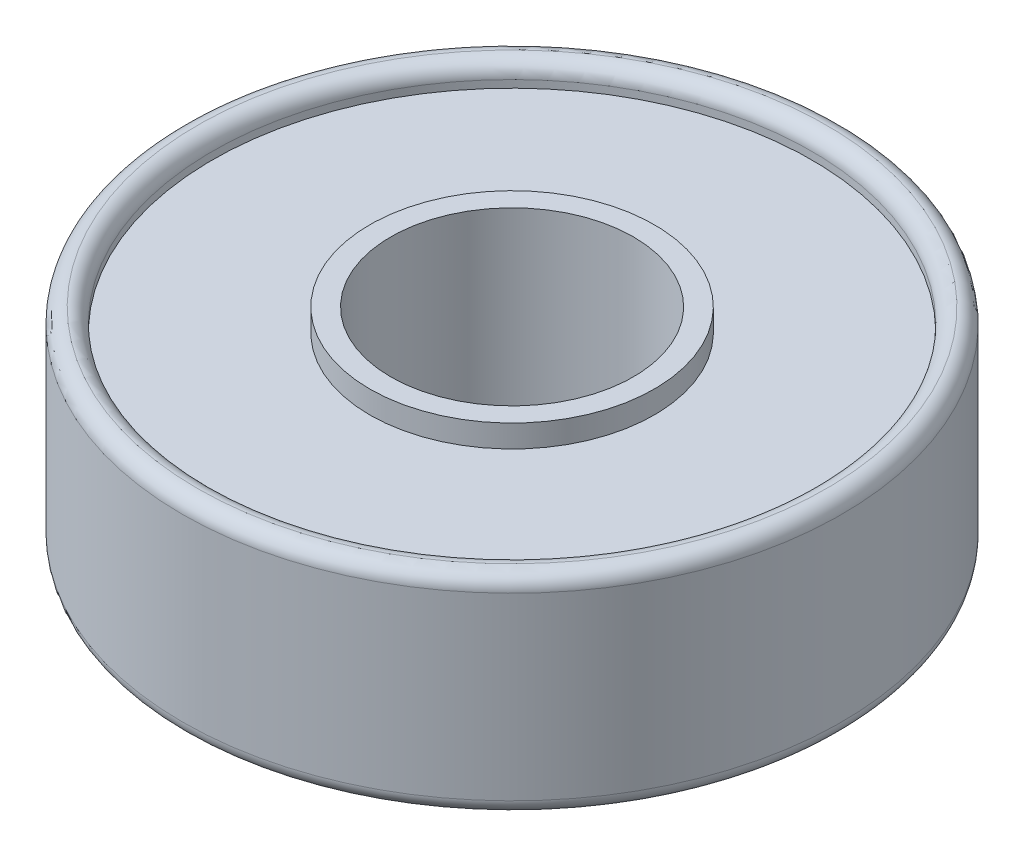
ISO-10303-21;
HEADER;
FILE_DESCRIPTION(('STEP AP214'),'2;1');
FILE_NAME('part.step','',(''),(''),'','','');
FILE_SCHEMA(('AUTOMOTIVE_DESIGN { 1 0 10303 214 1 1 1 1 }'));
ENDSEC;
DATA;
#1=APPLICATION_CONTEXT('core data for automotive mechanical design processes');
#2=APPLICATION_PROTOCOL_DEFINITION('international standard','automotive_design',2000,#1);
#3=PRODUCT_CONTEXT('',#1,'mechanical');
#4=PRODUCT('Part','Part','',(#3));
#5=PRODUCT_RELATED_PRODUCT_CATEGORY('part','',(#4));
#6=PRODUCT_DEFINITION_FORMATION('','',#4);
#7=PRODUCT_DEFINITION_CONTEXT('part definition',#1,'design');
#8=PRODUCT_DEFINITION('design','',#6,#7);
#9=PRODUCT_DEFINITION_SHAPE('','',#8);
#10=(LENGTH_UNIT() NAMED_UNIT(*) SI_UNIT(.MILLI.,.METRE.));
#11=(NAMED_UNIT(*) PLANE_ANGLE_UNIT() SI_UNIT($,.RADIAN.));
#12=(NAMED_UNIT(*) SI_UNIT($,.STERADIAN.) SOLID_ANGLE_UNIT());
#13=UNCERTAINTY_MEASURE_WITH_UNIT(LENGTH_MEASURE(1.E-05),#10,'distance_accuracy_value','');
#14=(GEOMETRIC_REPRESENTATION_CONTEXT(3) GLOBAL_UNCERTAINTY_ASSIGNED_CONTEXT((#13)) GLOBAL_UNIT_ASSIGNED_CONTEXT((#10,
#11,#12)) REPRESENTATION_CONTEXT('',''));
#15=CARTESIAN_POINT('',(0.,0.,0.));
#16=DIRECTION('',(0.,0.,1.));
#17=DIRECTION('',(1.,0.,0.));
#18=AXIS2_PLACEMENT_3D('',#15,#16,#17);
#19=CARTESIAN_POINT('',(0.,-3.5,0.));
#20=DIRECTION('',(0.,1.,0.));
#21=DIRECTION('',(0.,0.,1.));
#22=AXIS2_PLACEMENT_3D('',#19,#20,#21);
#23=CYLINDRICAL_SURFACE('',#22,10.);
#24=CARTESIAN_POINT('',(0.,-3.,0.));
#25=DIRECTION('',(0.,1.,0.));
#26=DIRECTION('',(0.,0.,1.));
#27=AXIS2_PLACEMENT_3D('',#24,#25,#26);
#28=CIRCLE('',#27,10.);
#29=CARTESIAN_POINT('',(0.,-3.,10.));
#30=VERTEX_POINT('',#29);
#31=EDGE_CURVE('E48',#30,#30,#28,.F.);
#32=ORIENTED_EDGE('',*,*,#31,.T.);
#33=EDGE_LOOP('',(#32));
#34=FACE_BOUND('',#33,.T.);
#35=CARTESIAN_POINT('',(0.,-2.75,0.));
#36=DIRECTION('',(0.,1.,0.));
#37=DIRECTION('',(0.,0.,1.));
#38=AXIS2_PLACEMENT_3D('',#35,#36,#37);
#39=CIRCLE('',#38,10.);
#40=CARTESIAN_POINT('',(0.,-2.75,10.));
#41=VERTEX_POINT('',#40);
#42=EDGE_CURVE('E108',#41,#41,#39,.F.);
#43=ORIENTED_EDGE('',*,*,#42,.F.);
#44=EDGE_LOOP('',(#43));
#45=FACE_BOUND('',#44,.T.);
#46=ADVANCED_FACE('F39',(#34,#45),#23,.F.);
#47=CARTESIAN_POINT('',(0.,3.5,0.));
#48=DIRECTION('',(0.,-1.,0.));
#49=DIRECTION('',(0.,0.,-1.));
#50=AXIS2_PLACEMENT_3D('',#47,#48,#49);
#51=CYLINDRICAL_SURFACE('',#50,11.);
#52=CARTESIAN_POINT('',(0.,-3.,0.));
#53=DIRECTION('',(0.,1.,0.));
#54=DIRECTION('',(0.,0.,1.));
#55=AXIS2_PLACEMENT_3D('',#52,#53,#54);
#56=CIRCLE('',#55,11.);
#57=CARTESIAN_POINT('',(0.,-3.,11.));
#58=VERTEX_POINT('',#57);
#59=EDGE_CURVE('E54',#58,#58,#56,.T.);
#60=ORIENTED_EDGE('',*,*,#59,.T.);
#61=EDGE_LOOP('',(#60));
#62=FACE_BOUND('',#61,.T.);
#63=CARTESIAN_POINT('',(0.,3.,0.));
#64=DIRECTION('',(0.,1.,0.));
#65=DIRECTION('',(0.,0.,1.));
#66=AXIS2_PLACEMENT_3D('',#63,#64,#65);
#67=CIRCLE('',#66,11.);
#68=CARTESIAN_POINT('',(0.,3.,11.));
#69=VERTEX_POINT('',#68);
#70=EDGE_CURVE('E114',#69,#69,#67,.F.);
#71=ORIENTED_EDGE('',*,*,#70,.T.);
#72=EDGE_LOOP('',(#71));
#73=FACE_BOUND('',#72,.T.);
#74=ADVANCED_FACE('F84',(#62,#73),#51,.T.);
#75=CARTESIAN_POINT('',(0.,3.,0.));
#76=DIRECTION('',(0.,1.,0.));
#77=DIRECTION('',(0.,0.,1.));
#78=AXIS2_PLACEMENT_3D('',#75,#76,#77);
#79=CIRCLE('',#78,10.);
#80=CARTESIAN_POINT('',(0.,3.,10.));
#81=VERTEX_POINT('',#80);
#82=EDGE_CURVE('E10',#81,#81,#79,.T.);
#83=ORIENTED_EDGE('',*,*,#82,.T.);
#84=EDGE_LOOP('',(#83));
#85=FACE_BOUND('',#84,.T.);
#86=CARTESIAN_POINT('',(0.,2.75,0.));
#87=DIRECTION('',(0.,1.,0.));
#88=DIRECTION('',(0.,0.,1.));
#89=AXIS2_PLACEMENT_3D('',#86,#87,#88);
#90=CIRCLE('',#89,10.);
#91=CARTESIAN_POINT('',(0.,2.75,10.));
#92=VERTEX_POINT('',#91);
#93=EDGE_CURVE('E105',#92,#92,#90,.T.);
#94=ORIENTED_EDGE('',*,*,#93,.F.);
#95=EDGE_LOOP('',(#94));
#96=FACE_BOUND('',#95,.T.);
#97=ADVANCED_FACE('F87',(#85,#96),#23,.F.);
#98=CARTESIAN_POINT('',(0.,-2.75,0.));
#99=DIRECTION('',(0.,1.,0.));
#100=DIRECTION('',(0.,0.,1.));
#101=AXIS2_PLACEMENT_3D('',#98,#99,#100);
#102=PLANE('',#101);
#103=CARTESIAN_POINT('',(0.,-2.75,0.));
#104=DIRECTION('',(0.,1.,0.));
#105=DIRECTION('',(0.,0.,1.));
#106=AXIS2_PLACEMENT_3D('',#103,#104,#105);
#107=CIRCLE('',#106,4.75);
#108=CARTESIAN_POINT('',(0.,-2.75,4.75));
#109=VERTEX_POINT('',#108);
#110=EDGE_CURVE('E117',#109,#109,#107,.F.);
#111=ORIENTED_EDGE('',*,*,#110,.F.);
#112=EDGE_LOOP('',(#111));
#113=FACE_BOUND('',#112,.T.);
#114=ORIENTED_EDGE('',*,*,#42,.T.);
#115=EDGE_LOOP('',(#114));
#116=FACE_BOUND('',#115,.T.);
#117=ADVANCED_FACE('F96',(#113,#116),#102,.F.);
#118=CARTESIAN_POINT('',(0.,2.75,0.));
#119=DIRECTION('',(0.,1.,0.));
#120=DIRECTION('',(0.,0.,1.));
#121=AXIS2_PLACEMENT_3D('',#118,#119,#120);
#122=PLANE('',#121);
#123=CARTESIAN_POINT('',(0.,2.75,0.));
#124=DIRECTION('',(0.,1.,0.));
#125=DIRECTION('',(0.,0.,1.));
#126=AXIS2_PLACEMENT_3D('',#123,#124,#125);
#127=CIRCLE('',#126,4.75);
#128=CARTESIAN_POINT('',(0.,2.75,4.75));
#129=VERTEX_POINT('',#128);
#130=EDGE_CURVE('E109',#129,#129,#127,.T.);
#131=ORIENTED_EDGE('',*,*,#130,.F.);
#132=EDGE_LOOP('',(#131));
#133=FACE_BOUND('',#132,.T.);
#134=ORIENTED_EDGE('',*,*,#93,.T.);
#135=EDGE_LOOP('',(#134));
#136=FACE_BOUND('',#135,.T.);
#137=ADVANCED_FACE('F100',(#133,#136),#122,.T.);
#138=CARTESIAN_POINT('',(0.,3.5,0.));
#139=DIRECTION('',(0.,1.,0.));
#140=DIRECTION('',(0.,0.,1.));
#141=AXIS2_PLACEMENT_3D('',#138,#139,#140);
#142=PLANE('',#141);
#143=CARTESIAN_POINT('',(0.,3.5,0.));
#144=DIRECTION('',(0.,1.,0.));
#145=DIRECTION('',(0.,0.,1.));
#146=AXIS2_PLACEMENT_3D('',#143,#144,#145);
#147=CIRCLE('',#146,4.05);
#148=CARTESIAN_POINT('',(0.,3.5,4.05));
#149=VERTEX_POINT('',#148);
#150=EDGE_CURVE('E60',#149,#149,#147,.T.);
#151=ORIENTED_EDGE('',*,*,#150,.F.);
#152=EDGE_LOOP('',(#151));
#153=FACE_BOUND('',#152,.T.);
#154=CARTESIAN_POINT('',(0.,3.5,0.));
#155=DIRECTION('',(0.,1.,0.));
#156=DIRECTION('',(0.,0.,1.));
#157=AXIS2_PLACEMENT_3D('',#154,#155,#156);
#158=CIRCLE('',#157,4.75);
#159=CARTESIAN_POINT('',(0.,3.5,4.75));
#160=VERTEX_POINT('',#159);
#161=EDGE_CURVE('E132',#160,#160,#158,.T.);
#162=ORIENTED_EDGE('',*,*,#161,.T.);
#163=EDGE_LOOP('',(#162));
#164=FACE_BOUND('',#163,.T.);
#165=ADVANCED_FACE('F153',(#153,#164),#142,.T.);
#166=CARTESIAN_POINT('',(0.,3.5,0.));
#167=DIRECTION('',(0.,-1.,0.));
#168=DIRECTION('',(0.,0.,-1.));
#169=AXIS2_PLACEMENT_3D('',#166,#167,#168);
#170=CYLINDRICAL_SURFACE('',#169,4.75);
#171=ORIENTED_EDGE('',*,*,#130,.T.);
#172=EDGE_LOOP('',(#171));
#173=FACE_BOUND('',#172,.T.);
#174=ORIENTED_EDGE('',*,*,#161,.F.);
#175=EDGE_LOOP('',(#174));
#176=FACE_BOUND('',#175,.T.);
#177=ADVANCED_FACE('F156',(#173,#176),#170,.T.);
#178=CARTESIAN_POINT('',(0.,-3.5,0.));
#179=DIRECTION('',(0.,1.,0.));
#180=DIRECTION('',(0.,0.,1.));
#181=AXIS2_PLACEMENT_3D('',#178,#179,#180);
#182=CIRCLE('',#181,4.75);
#183=CARTESIAN_POINT('',(0.,-3.5,4.75));
#184=VERTEX_POINT('',#183);
#185=EDGE_CURVE('E133',#184,#184,#182,.T.);
#186=ORIENTED_EDGE('',*,*,#185,.T.);
#187=EDGE_LOOP('',(#186));
#188=FACE_BOUND('',#187,.T.);
#189=ORIENTED_EDGE('',*,*,#110,.T.);
#190=EDGE_LOOP('',(#189));
#191=FACE_BOUND('',#190,.T.);
#192=ADVANCED_FACE('F161',(#188,#191),#170,.T.);
#193=CARTESIAN_POINT('',(0.,-3.5,0.));
#194=DIRECTION('',(0.,1.,0.));
#195=DIRECTION('',(0.,0.,1.));
#196=AXIS2_PLACEMENT_3D('',#193,#194,#195);
#197=PLANE('',#196);
#198=CARTESIAN_POINT('',(0.,-3.5,0.));
#199=DIRECTION('',(0.,1.,0.));
#200=DIRECTION('',(0.,0.,1.));
#201=AXIS2_PLACEMENT_3D('',#198,#199,#200);
#202=CIRCLE('',#201,4.05);
#203=CARTESIAN_POINT('',(0.,-3.5,4.05));
#204=VERTEX_POINT('',#203);
#205=EDGE_CURVE('E66',#204,#204,#202,.T.);
#206=ORIENTED_EDGE('',*,*,#205,.T.);
#207=EDGE_LOOP('',(#206));
#208=FACE_BOUND('',#207,.T.);
#209=ORIENTED_EDGE('',*,*,#185,.F.);
#210=EDGE_LOOP('',(#209));
#211=FACE_BOUND('',#210,.T.);
#212=ADVANCED_FACE('F144',(#208,#211),#197,.F.);
#213=CARTESIAN_POINT('',(0.,-3.5,0.));
#214=DIRECTION('',(0.,1.,0.));
#215=DIRECTION('',(0.,0.,1.));
#216=AXIS2_PLACEMENT_3D('',#213,#214,#215);
#217=CYLINDRICAL_SURFACE('',#216,4.05);
#218=ORIENTED_EDGE('',*,*,#205,.F.);
#219=EDGE_LOOP('',(#218));
#220=FACE_BOUND('',#219,.T.);
#221=ORIENTED_EDGE('',*,*,#150,.T.);
#222=EDGE_LOOP('',(#221));
#223=FACE_BOUND('',#222,.T.);
#224=ADVANCED_FACE('F147',(#220,#223),#217,.F.);
#225=CARTESIAN_POINT('',(0.,-3.,0.));
#226=DIRECTION('',(0.,1.,0.));
#227=DIRECTION('',(0.,0.,1.));
#228=AXIS2_PLACEMENT_3D('',#225,#226,#227);
#229=TOROIDAL_SURFACE('',#228,10.5,0.5);
#230=ORIENTED_EDGE('',*,*,#31,.F.);
#231=EDGE_LOOP('',(#230));
#232=FACE_BOUND('',#231,.T.);
#233=CARTESIAN_POINT('',(0.,-3.5,0.));
#234=DIRECTION('',(0.,1.,0.));
#235=DIRECTION('',(0.,0.,1.));
#236=AXIS2_PLACEMENT_3D('',#233,#234,#235);
#237=CIRCLE('',#236,10.5);
#238=CARTESIAN_POINT('',(0.,-3.5,10.5));
#239=VERTEX_POINT('',#238);
#240=EDGE_CURVE('E57',#239,#239,#237,.T.);
#241=ORIENTED_EDGE('',*,*,#240,.F.);
#242=EDGE_LOOP('',(#241));
#243=FACE_BOUND('',#242,.T.);
#244=ADVANCED_FACE('F81',(#232,#243),#229,.T.);
#245=CARTESIAN_POINT('',(0.,-3.,0.));
#246=DIRECTION('',(0.,1.,0.));
#247=DIRECTION('',(0.,0.,1.));
#248=AXIS2_PLACEMENT_3D('',#245,#246,#247);
#249=TOROIDAL_SURFACE('',#248,10.5,0.5);
#250=ORIENTED_EDGE('',*,*,#240,.T.);
#251=EDGE_LOOP('',(#250));
#252=FACE_BOUND('',#251,.T.);
#253=ORIENTED_EDGE('',*,*,#59,.F.);
#254=EDGE_LOOP('',(#253));
#255=FACE_BOUND('',#254,.T.);
#256=ADVANCED_FACE('F74',(#252,#255),#249,.T.);
#257=CARTESIAN_POINT('',(0.,3.,0.));
#258=DIRECTION('',(0.,1.,0.));
#259=DIRECTION('',(0.,0.,1.));
#260=AXIS2_PLACEMENT_3D('',#257,#258,#259);
#261=TOROIDAL_SURFACE('',#260,10.5,0.5);
#262=ORIENTED_EDGE('',*,*,#82,.F.);
#263=EDGE_LOOP('',(#262));
#264=FACE_BOUND('',#263,.T.);
#265=CARTESIAN_POINT('',(0.,3.5,0.));
#266=DIRECTION('',(0.,1.,0.));
#267=DIRECTION('',(0.,0.,1.));
#268=AXIS2_PLACEMENT_3D('',#265,#266,#267);
#269=CIRCLE('',#268,10.5);
#270=CARTESIAN_POINT('',(0.,3.5,10.5));
#271=VERTEX_POINT('',#270);
#272=EDGE_CURVE('E43',#271,#271,#269,.F.);
#273=ORIENTED_EDGE('',*,*,#272,.F.);
#274=EDGE_LOOP('',(#273));
#275=FACE_BOUND('',#274,.T.);
#276=ADVANCED_FACE('F41',(#264,#275),#261,.T.);
#277=CARTESIAN_POINT('',(0.,3.,0.));
#278=DIRECTION('',(0.,1.,0.));
#279=DIRECTION('',(0.,0.,1.));
#280=AXIS2_PLACEMENT_3D('',#277,#278,#279);
#281=TOROIDAL_SURFACE('',#280,10.5,0.5);
#282=ORIENTED_EDGE('',*,*,#70,.F.);
#283=EDGE_LOOP('',(#282));
#284=FACE_BOUND('',#283,.T.);
#285=ORIENTED_EDGE('',*,*,#272,.T.);
#286=EDGE_LOOP('',(#285));
#287=FACE_BOUND('',#286,.T.);
#288=ADVANCED_FACE('F71',(#284,#287),#281,.T.);
#289=CLOSED_SHELL('',(#46,#74,#97,#117,#137,#165,#177,#192,#212,#224,#244,#256,#276,#288));
#290=MANIFOLD_SOLID_BREP('B2',#289);
#291=ADVANCED_BREP_SHAPE_REPRESENTATION('',(#18,#290),#14);
#292=SHAPE_DEFINITION_REPRESENTATION(#9,#291);
ENDSEC;
END-ISO-10303-21;
